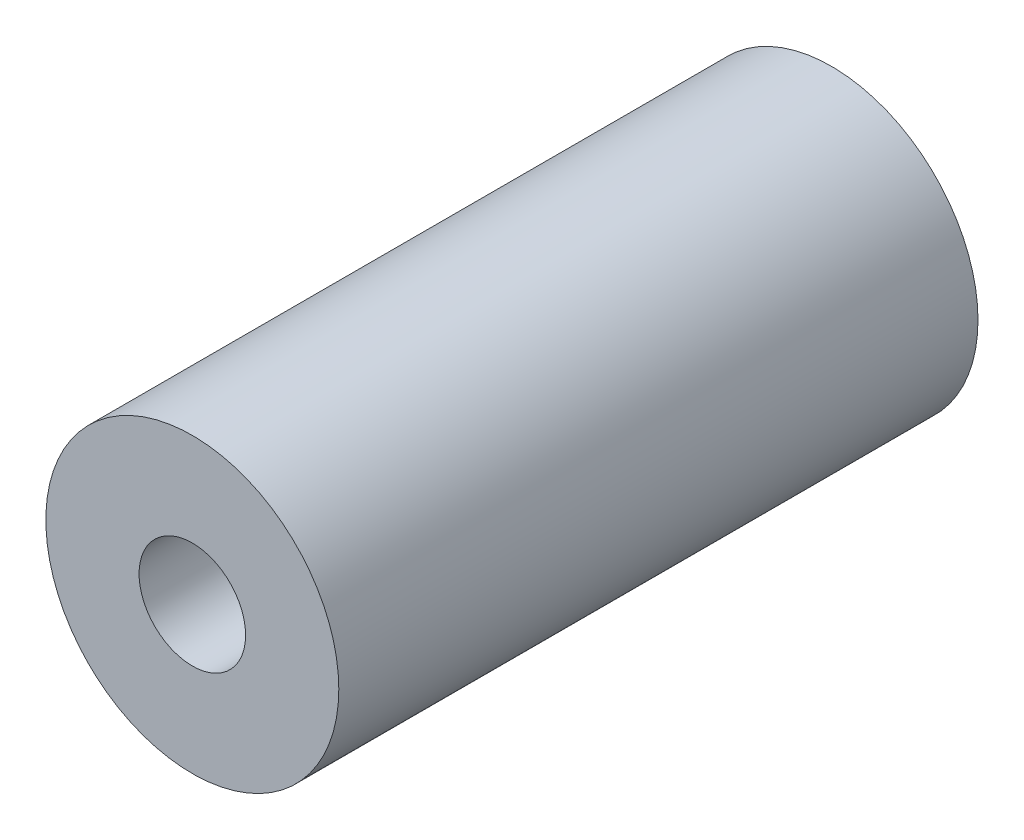
ISO-10303-21;
HEADER;
FILE_DESCRIPTION(('STEP AP214'),'2;1');
FILE_NAME('part.step','',(''),(''),'','','');
FILE_SCHEMA(('AUTOMOTIVE_DESIGN { 1 0 10303 214 1 1 1 1 }'));
ENDSEC;
DATA;
#1=APPLICATION_CONTEXT('core data for automotive mechanical design processes');
#2=APPLICATION_PROTOCOL_DEFINITION('international standard','automotive_design',2000,#1);
#3=PRODUCT_CONTEXT('',#1,'mechanical');
#4=PRODUCT('Part','Part','',(#3));
#5=PRODUCT_RELATED_PRODUCT_CATEGORY('part','',(#4));
#6=PRODUCT_DEFINITION_FORMATION('','',#4);
#7=PRODUCT_DEFINITION_CONTEXT('part definition',#1,'design');
#8=PRODUCT_DEFINITION('design','',#6,#7);
#9=PRODUCT_DEFINITION_SHAPE('','',#8);
#10=(LENGTH_UNIT() NAMED_UNIT(*) SI_UNIT(.MILLI.,.METRE.));
#11=(NAMED_UNIT(*) PLANE_ANGLE_UNIT() SI_UNIT($,.RADIAN.));
#12=(NAMED_UNIT(*) SI_UNIT($,.STERADIAN.) SOLID_ANGLE_UNIT());
#13=UNCERTAINTY_MEASURE_WITH_UNIT(LENGTH_MEASURE(1.E-05),#10,'distance_accuracy_value','');
#14=(GEOMETRIC_REPRESENTATION_CONTEXT(3) GLOBAL_UNCERTAINTY_ASSIGNED_CONTEXT((#13)) GLOBAL_UNIT_ASSIGNED_CONTEXT((#10,
#11,#12)) REPRESENTATION_CONTEXT('',''));
#15=CARTESIAN_POINT('',(0.,0.,0.));
#16=DIRECTION('',(0.,0.,1.));
#17=DIRECTION('',(1.,0.,0.));
#18=AXIS2_PLACEMENT_3D('',#15,#16,#17);
#19=CARTESIAN_POINT('',(0.,0.,12.));
#20=DIRECTION('',(0.,0.,1.));
#21=DIRECTION('',(1.,0.,0.));
#22=AXIS2_PLACEMENT_3D('',#19,#20,#21);
#23=PLANE('',#22);
#24=CARTESIAN_POINT('',(0.,0.,12.));
#25=DIRECTION('',(0.,0.,1.));
#26=DIRECTION('',(1.,0.,0.));
#27=AXIS2_PLACEMENT_3D('',#24,#25,#26);
#28=CIRCLE('',#27,2.75);
#29=CARTESIAN_POINT('',(2.75,0.,12.));
#30=VERTEX_POINT('',#29);
#31=EDGE_CURVE('E10',#30,#30,#28,.T.);
#32=ORIENTED_EDGE('',*,*,#31,.T.);
#33=EDGE_LOOP('',(#32));
#34=FACE_BOUND('',#33,.T.);
#35=CARTESIAN_POINT('',(0.,0.,12.));
#36=DIRECTION('',(0.,0.,1.));
#37=DIRECTION('',(1.,0.,0.));
#38=AXIS2_PLACEMENT_3D('',#35,#36,#37);
#39=CIRCLE('',#38,1.);
#40=CARTESIAN_POINT('',(1.,0.,12.));
#41=VERTEX_POINT('',#40);
#42=EDGE_CURVE('E41',#41,#41,#39,.T.);
#43=ORIENTED_EDGE('',*,*,#42,.F.);
#44=EDGE_LOOP('',(#43));
#45=FACE_BOUND('',#44,.T.);
#46=ADVANCED_FACE('F30',(#34,#45),#23,.T.);
#47=CARTESIAN_POINT('',(0.,0.,0.));
#48=DIRECTION('',(0.,0.,1.));
#49=DIRECTION('',(1.,0.,0.));
#50=AXIS2_PLACEMENT_3D('',#47,#48,#49);
#51=PLANE('',#50);
#52=CARTESIAN_POINT('',(0.,0.,0.));
#53=DIRECTION('',(0.,0.,1.));
#54=DIRECTION('',(1.,0.,0.));
#55=AXIS2_PLACEMENT_3D('',#52,#53,#54);
#56=CIRCLE('',#55,2.75);
#57=CARTESIAN_POINT('',(2.75,0.,0.));
#58=VERTEX_POINT('',#57);
#59=EDGE_CURVE('E34',#58,#58,#56,.T.);
#60=ORIENTED_EDGE('',*,*,#59,.F.);
#61=EDGE_LOOP('',(#60));
#62=FACE_BOUND('',#61,.T.);
#63=CARTESIAN_POINT('',(0.,0.,0.));
#64=DIRECTION('',(0.,0.,1.));
#65=DIRECTION('',(1.,0.,0.));
#66=AXIS2_PLACEMENT_3D('',#63,#64,#65);
#67=CIRCLE('',#66,1.);
#68=CARTESIAN_POINT('',(1.,0.,0.));
#69=VERTEX_POINT('',#68);
#70=EDGE_CURVE('E43',#69,#69,#67,.T.);
#71=ORIENTED_EDGE('',*,*,#70,.T.);
#72=EDGE_LOOP('',(#71));
#73=FACE_BOUND('',#72,.T.);
#74=ADVANCED_FACE('F53',(#62,#73),#51,.F.);
#75=CARTESIAN_POINT('',(0.,0.,12.));
#76=DIRECTION('',(0.,0.,-1.));
#77=DIRECTION('',(-1.,0.,0.));
#78=AXIS2_PLACEMENT_3D('',#75,#76,#77);
#79=CYLINDRICAL_SURFACE('',#78,2.75);
#80=ORIENTED_EDGE('',*,*,#31,.F.);
#81=EDGE_LOOP('',(#80));
#82=FACE_BOUND('',#81,.T.);
#83=ORIENTED_EDGE('',*,*,#59,.T.);
#84=EDGE_LOOP('',(#83));
#85=FACE_BOUND('',#84,.T.);
#86=ADVANCED_FACE('F32',(#82,#85),#79,.T.);
#87=CARTESIAN_POINT('',(0.,0.,12.));
#88=DIRECTION('',(0.,0.,-1.));
#89=DIRECTION('',(-1.,0.,0.));
#90=AXIS2_PLACEMENT_3D('',#87,#88,#89);
#91=CYLINDRICAL_SURFACE('',#90,1.);
#92=ORIENTED_EDGE('',*,*,#42,.T.);
#93=EDGE_LOOP('',(#92));
#94=FACE_BOUND('',#93,.T.);
#95=ORIENTED_EDGE('',*,*,#70,.F.);
#96=EDGE_LOOP('',(#95));
#97=FACE_BOUND('',#96,.T.);
#98=ADVANCED_FACE('F49',(#94,#97),#91,.F.);
#99=CLOSED_SHELL('',(#46,#74,#86,#98));
#100=MANIFOLD_SOLID_BREP('B2',#99);
#101=ADVANCED_BREP_SHAPE_REPRESENTATION('',(#18,#100),#14);
#102=SHAPE_DEFINITION_REPRESENTATION(#9,#101);
ENDSEC;
END-ISO-10303-21;
